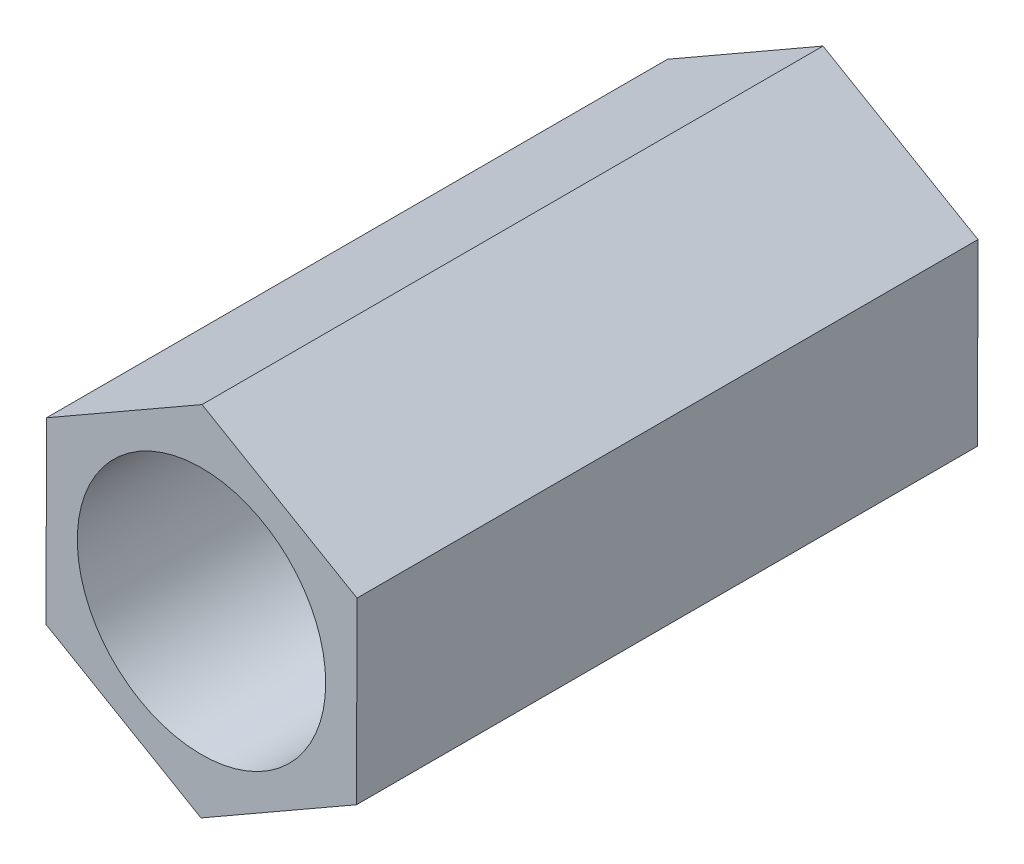
ISO-10303-21;
HEADER;
FILE_DESCRIPTION(('STEP AP214'),'2;1');
FILE_NAME('part.step','',(''),(''),'','','');
FILE_SCHEMA(('AUTOMOTIVE_DESIGN { 1 0 10303 214 1 1 1 1 }'));
ENDSEC;
DATA;
#1=APPLICATION_CONTEXT('core data for automotive mechanical design processes');
#2=APPLICATION_PROTOCOL_DEFINITION('international standard','automotive_design',2000,#1);
#3=PRODUCT_CONTEXT('',#1,'mechanical');
#4=PRODUCT('Part','Part','',(#3));
#5=PRODUCT_RELATED_PRODUCT_CATEGORY('part','',(#4));
#6=PRODUCT_DEFINITION_FORMATION('','',#4);
#7=PRODUCT_DEFINITION_CONTEXT('part definition',#1,'design');
#8=PRODUCT_DEFINITION('design','',#6,#7);
#9=PRODUCT_DEFINITION_SHAPE('','',#8);
#10=(LENGTH_UNIT() NAMED_UNIT(*) SI_UNIT(.MILLI.,.METRE.));
#11=(NAMED_UNIT(*) PLANE_ANGLE_UNIT() SI_UNIT($,.RADIAN.));
#12=(NAMED_UNIT(*) SI_UNIT($,.STERADIAN.) SOLID_ANGLE_UNIT());
#13=UNCERTAINTY_MEASURE_WITH_UNIT(LENGTH_MEASURE(1.E-05),#10,'distance_accuracy_value','');
#14=(GEOMETRIC_REPRESENTATION_CONTEXT(3) GLOBAL_UNCERTAINTY_ASSIGNED_CONTEXT((#13)) GLOBAL_UNIT_ASSIGNED_CONTEXT((#10,
#11,#12)) REPRESENTATION_CONTEXT('',''));
#15=CARTESIAN_POINT('',(0.,0.,0.));
#16=DIRECTION('',(0.,0.,1.));
#17=DIRECTION('',(1.,0.,0.));
#18=AXIS2_PLACEMENT_3D('',#15,#16,#17);
#19=CARTESIAN_POINT('',(2.4957582701814,-1.45069775975373,10.));
#20=DIRECTION('',(-0.9999957036864,0.00293131518967844,0.));
#21=DIRECTION('',(-0.00293131518967844,-0.9999957036864,0.));
#22=AXIS2_PLACEMENT_3D('',#19,#20,#21);
#23=PLANE('',#22);
#24=DIRECTION('',(0.00293131518967844,0.9999957036864,0.));
#25=VECTOR('',#24,1.);
#26=CARTESIAN_POINT('',(2.4957582701814,-1.45069775975373,0.));
#27=LINE('',#26,#25);
#28=CARTESIAN_POINT('',(2.4957582701814,-1.45069775975373,0.));
#29=VERTEX_POINT('',#28);
#30=CARTESIAN_POINT('',(2.5042202482506,1.43604118380533,0.));
#31=VERTEX_POINT('',#30);
#32=EDGE_CURVE('E121',#29,#31,#27,.T.);
#33=ORIENTED_EDGE('',*,*,#32,.T.);
#34=DIRECTION('',(0.,0.,-1.));
#35=VECTOR('',#34,1.);
#36=CARTESIAN_POINT('',(2.5042202482506,1.43604118380533,10.));
#37=LINE('',#36,#35);
#38=CARTESIAN_POINT('',(2.5042202482506,1.43604118380533,10.));
#39=VERTEX_POINT('',#38);
#40=EDGE_CURVE('E11',#39,#31,#37,.T.);
#41=ORIENTED_EDGE('',*,*,#40,.F.);
#42=DIRECTION('',(0.00293131518967844,0.9999957036864,0.));
#43=VECTOR('',#42,1.);
#44=CARTESIAN_POINT('',(2.4957582701814,-1.45069775975373,10.));
#45=LINE('',#44,#43);
#46=CARTESIAN_POINT('',(2.4957582701814,-1.45069775975373,10.));
#47=VERTEX_POINT('',#46);
#48=EDGE_CURVE('E132',#47,#39,#45,.T.);
#49=ORIENTED_EDGE('',*,*,#48,.F.);
#50=DIRECTION('',(0.,0.,-1.));
#51=VECTOR('',#50,1.);
#52=CARTESIAN_POINT('',(2.4957582701814,-1.45069775975373,10.));
#53=LINE('',#52,#51);
#54=EDGE_CURVE('E117',#47,#29,#53,.T.);
#55=ORIENTED_EDGE('',*,*,#54,.T.);
#56=EDGE_LOOP('',(#33,#41,#49,#55));
#57=FACE_BOUND('',#56,.T.);
#58=ADVANCED_FACE('F37',(#57),#23,.F.);
#59=CARTESIAN_POINT('',(2.5042202482506,1.43604118380533,10.));
#60=DIRECTION('',(-0.502536445263962,-0.864556025472879,0.));
#61=DIRECTION('',(0.864556025472879,-0.502536445263962,0.));
#62=AXIS2_PLACEMENT_3D('',#59,#60,#61);
#63=PLANE('',#62);
#64=DIRECTION('',(-0.864556025472879,0.502536445263962,0.));
#65=VECTOR('',#64,1.);
#66=CARTESIAN_POINT('',(2.5042202482506,1.43604118380533,0.));
#67=LINE('',#66,#65);
#68=CARTESIAN_POINT('',(0.00846197806920633,2.88673894355906,0.));
#69=VERTEX_POINT('',#68);
#70=EDGE_CURVE('E124',#31,#69,#67,.T.);
#71=ORIENTED_EDGE('',*,*,#70,.T.);
#72=DIRECTION('',(0.,0.,-1.));
#73=VECTOR('',#72,1.);
#74=CARTESIAN_POINT('',(0.00846197806920633,2.88673894355906,10.));
#75=LINE('',#74,#73);
#76=CARTESIAN_POINT('',(0.00846197806920633,2.88673894355906,10.));
#77=VERTEX_POINT('',#76);
#78=EDGE_CURVE('E45',#77,#69,#75,.T.);
#79=ORIENTED_EDGE('',*,*,#78,.F.);
#80=DIRECTION('',(-0.864556025472879,0.502536445263962,0.));
#81=VECTOR('',#80,1.);
#82=CARTESIAN_POINT('',(2.5042202482506,1.43604118380533,10.));
#83=LINE('',#82,#81);
#84=EDGE_CURVE('E90',#39,#77,#83,.T.);
#85=ORIENTED_EDGE('',*,*,#84,.F.);
#86=ORIENTED_EDGE('',*,*,#40,.T.);
#87=EDGE_LOOP('',(#71,#79,#85,#86));
#88=FACE_BOUND('',#87,.T.);
#89=ADVANCED_FACE('F157',(#88),#63,.F.);
#90=CARTESIAN_POINT('',(0.00846197806920633,2.88673894355906,10.));
#91=DIRECTION('',(0.497459258422438,-0.867487340662559,0.));
#92=DIRECTION('',(0.867487340662559,0.497459258422438,0.));
#93=AXIS2_PLACEMENT_3D('',#90,#91,#92);
#94=PLANE('',#93);
#95=DIRECTION('',(-0.867487340662559,-0.497459258422438,0.));
#96=VECTOR('',#95,1.);
#97=CARTESIAN_POINT('',(0.00846197806920633,2.88673894355906,0.));
#98=LINE('',#97,#96);
#99=CARTESIAN_POINT('',(-2.4957582701814,1.45069775975373,0.));
#100=VERTEX_POINT('',#99);
#101=EDGE_CURVE('E127',#69,#100,#98,.T.);
#102=ORIENTED_EDGE('',*,*,#101,.T.);
#103=DIRECTION('',(0.,0.,-1.));
#104=VECTOR('',#103,1.);
#105=CARTESIAN_POINT('',(-2.4957582701814,1.45069775975373,10.));
#106=LINE('',#105,#104);
#107=CARTESIAN_POINT('',(-2.4957582701814,1.45069775975373,10.));
#108=VERTEX_POINT('',#107);
#109=EDGE_CURVE('E112',#108,#100,#106,.T.);
#110=ORIENTED_EDGE('',*,*,#109,.F.);
#111=DIRECTION('',(-0.867487340662559,-0.497459258422438,0.));
#112=VECTOR('',#111,1.);
#113=CARTESIAN_POINT('',(0.00846197806920633,2.88673894355906,10.));
#114=LINE('',#113,#112);
#115=EDGE_CURVE('E103',#77,#108,#114,.T.);
#116=ORIENTED_EDGE('',*,*,#115,.F.);
#117=ORIENTED_EDGE('',*,*,#78,.T.);
#118=EDGE_LOOP('',(#102,#110,#116,#117));
#119=FACE_BOUND('',#118,.T.);
#120=ADVANCED_FACE('F138',(#119),#94,.F.);
#121=CARTESIAN_POINT('',(-2.4957582701814,1.45069775975373,10.));
#122=DIRECTION('',(0.9999957036864,-0.00293131518968024,0.));
#123=DIRECTION('',(0.00293131518968024,0.9999957036864,0.));
#124=AXIS2_PLACEMENT_3D('',#121,#122,#123);
#125=PLANE('',#124);
#126=DIRECTION('',(-0.00293131518968024,-0.9999957036864,0.));
#127=VECTOR('',#126,1.);
#128=CARTESIAN_POINT('',(-2.4957582701814,1.45069775975373,0.));
#129=LINE('',#128,#127);
#130=CARTESIAN_POINT('',(-2.5042202482506,-1.43604118380533,0.));
#131=VERTEX_POINT('',#130);
#132=EDGE_CURVE('E111',#100,#131,#129,.T.);
#133=ORIENTED_EDGE('',*,*,#132,.T.);
#134=DIRECTION('',(0.,0.,-1.));
#135=VECTOR('',#134,1.);
#136=CARTESIAN_POINT('',(-2.5042202482506,-1.43604118380533,10.));
#137=LINE('',#136,#135);
#138=CARTESIAN_POINT('',(-2.5042202482506,-1.43604118380533,10.));
#139=VERTEX_POINT('',#138);
#140=EDGE_CURVE('E108',#139,#131,#137,.T.);
#141=ORIENTED_EDGE('',*,*,#140,.F.);
#142=DIRECTION('',(-0.00293131518968024,-0.9999957036864,0.));
#143=VECTOR('',#142,1.);
#144=CARTESIAN_POINT('',(-2.4957582701814,1.45069775975373,10.));
#145=LINE('',#144,#143);
#146=EDGE_CURVE('E97',#108,#139,#145,.T.);
#147=ORIENTED_EDGE('',*,*,#146,.F.);
#148=ORIENTED_EDGE('',*,*,#109,.T.);
#149=EDGE_LOOP('',(#133,#141,#147,#148));
#150=FACE_BOUND('',#149,.T.);
#151=ADVANCED_FACE('F109',(#150),#125,.F.);
#152=CARTESIAN_POINT('',(-2.5042202482506,-1.43604118380533,10.));
#153=DIRECTION('',(0.502536445263962,0.864556025472879,0.));
#154=DIRECTION('',(-0.864556025472879,0.502536445263962,0.));
#155=AXIS2_PLACEMENT_3D('',#152,#153,#154);
#156=PLANE('',#155);
#157=DIRECTION('',(0.864556025472879,-0.502536445263962,0.));
#158=VECTOR('',#157,1.);
#159=CARTESIAN_POINT('',(-2.5042202482506,-1.43604118380533,0.));
#160=LINE('',#159,#158);
#161=CARTESIAN_POINT('',(-0.00846197806920719,-2.88673894355906,0.));
#162=VERTEX_POINT('',#161);
#163=EDGE_CURVE('E76',#131,#162,#160,.T.);
#164=ORIENTED_EDGE('',*,*,#163,.T.);
#165=DIRECTION('',(0.,0.,-1.));
#166=VECTOR('',#165,1.);
#167=CARTESIAN_POINT('',(-0.00846197806920719,-2.88673894355906,10.));
#168=LINE('',#167,#166);
#169=CARTESIAN_POINT('',(-0.00846197806920719,-2.88673894355906,10.));
#170=VERTEX_POINT('',#169);
#171=EDGE_CURVE('E113',#170,#162,#168,.T.);
#172=ORIENTED_EDGE('',*,*,#171,.F.);
#173=DIRECTION('',(0.864556025472879,-0.502536445263962,0.));
#174=VECTOR('',#173,1.);
#175=CARTESIAN_POINT('',(-2.5042202482506,-1.43604118380533,10.));
#176=LINE('',#175,#174);
#177=EDGE_CURVE('E101',#139,#170,#176,.T.);
#178=ORIENTED_EDGE('',*,*,#177,.F.);
#179=ORIENTED_EDGE('',*,*,#140,.T.);
#180=EDGE_LOOP('',(#164,#172,#178,#179));
#181=FACE_BOUND('',#180,.T.);
#182=ADVANCED_FACE('F115',(#181),#156,.F.);
#183=CARTESIAN_POINT('',(-0.00846197806920719,-2.88673894355906,10.));
#184=DIRECTION('',(-0.497459258422437,0.867487340662559,0.));
#185=DIRECTION('',(-0.867487340662559,-0.497459258422437,0.));
#186=AXIS2_PLACEMENT_3D('',#183,#184,#185);
#187=PLANE('',#186);
#188=DIRECTION('',(0.867487340662559,0.497459258422437,0.));
#189=VECTOR('',#188,1.);
#190=CARTESIAN_POINT('',(-0.00846197806920719,-2.88673894355906,0.));
#191=LINE('',#190,#189);
#192=EDGE_CURVE('E82',#162,#29,#191,.T.);
#193=ORIENTED_EDGE('',*,*,#192,.T.);
#194=ORIENTED_EDGE('',*,*,#54,.F.);
#195=DIRECTION('',(0.867487340662559,0.497459258422437,0.));
#196=VECTOR('',#195,1.);
#197=CARTESIAN_POINT('',(-0.00846197806920719,-2.88673894355906,10.));
#198=LINE('',#197,#196);
#199=EDGE_CURVE('E53',#170,#47,#198,.T.);
#200=ORIENTED_EDGE('',*,*,#199,.F.);
#201=ORIENTED_EDGE('',*,*,#171,.T.);
#202=EDGE_LOOP('',(#193,#194,#200,#201));
#203=FACE_BOUND('',#202,.T.);
#204=ADVANCED_FACE('F145',(#203),#187,.F.);
#205=CARTESIAN_POINT('',(0.,0.,10.));
#206=DIRECTION('',(0.,0.,1.));
#207=DIRECTION('',(1.,0.,0.));
#208=AXIS2_PLACEMENT_3D('',#205,#206,#207);
#209=PLANE('',#208);
#210=CARTESIAN_POINT('',(0.,0.,10.));
#211=DIRECTION('',(0.,0.,1.));
#212=DIRECTION('',(1.,0.,0.));
#213=AXIS2_PLACEMENT_3D('',#210,#211,#212);
#214=CIRCLE('',#213,2.);
#215=CARTESIAN_POINT('',(2.,0.,10.));
#216=VERTEX_POINT('',#215);
#217=EDGE_CURVE('E212',#216,#216,#214,.T.);
#218=ORIENTED_EDGE('',*,*,#217,.F.);
#219=EDGE_LOOP('',(#218));
#220=FACE_BOUND('',#219,.T.);
#221=ORIENTED_EDGE('',*,*,#48,.T.);
#222=ORIENTED_EDGE('',*,*,#84,.T.);
#223=ORIENTED_EDGE('',*,*,#115,.T.);
#224=ORIENTED_EDGE('',*,*,#146,.T.);
#225=ORIENTED_EDGE('',*,*,#177,.T.);
#226=ORIENTED_EDGE('',*,*,#199,.T.);
#227=EDGE_LOOP('',(#221,#222,#223,#224,#225,#226));
#228=FACE_BOUND('',#227,.T.);
#229=ADVANCED_FACE('F99',(#220,#228),#209,.T.);
#230=CARTESIAN_POINT('',(0.,0.,0.));
#231=DIRECTION('',(0.,0.,1.));
#232=DIRECTION('',(1.,0.,0.));
#233=AXIS2_PLACEMENT_3D('',#230,#231,#232);
#234=PLANE('',#233);
#235=CARTESIAN_POINT('',(0.,0.,0.));
#236=DIRECTION('',(0.,0.,1.));
#237=DIRECTION('',(1.,0.,0.));
#238=AXIS2_PLACEMENT_3D('',#235,#236,#237);
#239=CIRCLE('',#238,2.);
#240=CARTESIAN_POINT('',(2.,0.,0.));
#241=VERTEX_POINT('',#240);
#242=EDGE_CURVE('E125',#241,#241,#239,.T.);
#243=ORIENTED_EDGE('',*,*,#242,.T.);
#244=EDGE_LOOP('',(#243));
#245=FACE_BOUND('',#244,.T.);
#246=ORIENTED_EDGE('',*,*,#32,.F.);
#247=ORIENTED_EDGE('',*,*,#192,.F.);
#248=ORIENTED_EDGE('',*,*,#163,.F.);
#249=ORIENTED_EDGE('',*,*,#132,.F.);
#250=ORIENTED_EDGE('',*,*,#101,.F.);
#251=ORIENTED_EDGE('',*,*,#70,.F.);
#252=EDGE_LOOP('',(#246,#247,#248,#249,#250,#251));
#253=FACE_BOUND('',#252,.T.);
#254=ADVANCED_FACE('F141',(#245,#253),#234,.F.);
#255=CARTESIAN_POINT('',(0.,0.,10.));
#256=DIRECTION('',(0.,0.,1.));
#257=DIRECTION('',(1.,0.,0.));
#258=AXIS2_PLACEMENT_3D('',#255,#256,#257);
#259=CYLINDRICAL_SURFACE('',#258,2.);
#260=ORIENTED_EDGE('',*,*,#242,.F.);
#261=EDGE_LOOP('',(#260));
#262=FACE_BOUND('',#261,.T.);
#263=ORIENTED_EDGE('',*,*,#217,.T.);
#264=EDGE_LOOP('',(#263));
#265=FACE_BOUND('',#264,.T.);
#266=ADVANCED_FACE('F194',(#262,#265),#259,.F.);
#267=CLOSED_SHELL('',(#58,#89,#120,#151,#182,#204,#229,#254,#266));
#268=MANIFOLD_SOLID_BREP('B2',#267);
#269=ADVANCED_BREP_SHAPE_REPRESENTATION('',(#18,#268),#14);
#270=SHAPE_DEFINITION_REPRESENTATION(#9,#269);
ENDSEC;
END-ISO-10303-21;
